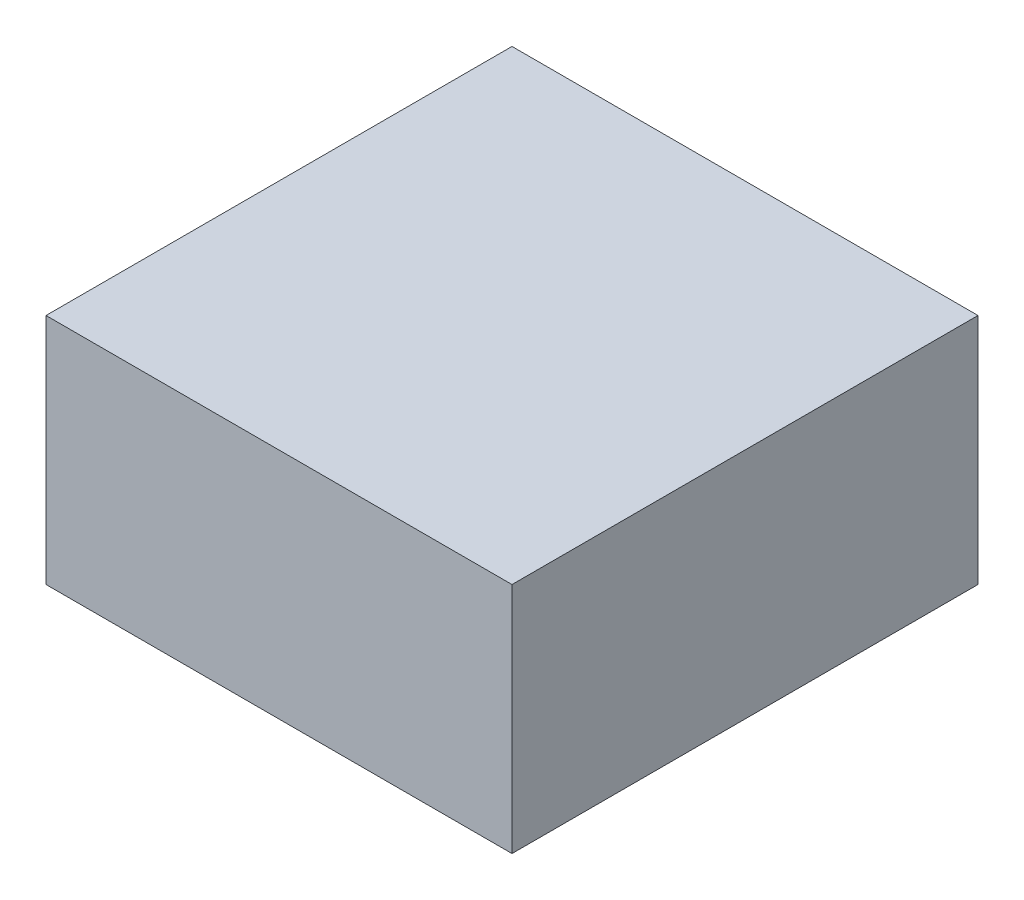
ISO-10303-21;
HEADER;
FILE_DESCRIPTION(('STEP AP214'),'2;1');
FILE_NAME('part.step','',(''),(''),'','','');
FILE_SCHEMA(('AUTOMOTIVE_DESIGN { 1 0 10303 214 1 1 1 1 }'));
ENDSEC;
DATA;
#1=APPLICATION_CONTEXT('core data for automotive mechanical design processes');
#2=APPLICATION_PROTOCOL_DEFINITION('international standard','automotive_design',2000,#1);
#3=PRODUCT_CONTEXT('',#1,'mechanical');
#4=PRODUCT('Part','Part','',(#3));
#5=PRODUCT_RELATED_PRODUCT_CATEGORY('part','',(#4));
#6=PRODUCT_DEFINITION_FORMATION('','',#4);
#7=PRODUCT_DEFINITION_CONTEXT('part definition',#1,'design');
#8=PRODUCT_DEFINITION('design','',#6,#7);
#9=PRODUCT_DEFINITION_SHAPE('','',#8);
#10=(LENGTH_UNIT() NAMED_UNIT(*) SI_UNIT(.MILLI.,.METRE.));
#11=(NAMED_UNIT(*) PLANE_ANGLE_UNIT() SI_UNIT($,.RADIAN.));
#12=(NAMED_UNIT(*) SI_UNIT($,.STERADIAN.) SOLID_ANGLE_UNIT());
#13=UNCERTAINTY_MEASURE_WITH_UNIT(LENGTH_MEASURE(1.E-05),#10,'distance_accuracy_value','');
#14=(GEOMETRIC_REPRESENTATION_CONTEXT(3) GLOBAL_UNCERTAINTY_ASSIGNED_CONTEXT((#13)) GLOBAL_UNIT_ASSIGNED_CONTEXT((#10,
#11,#12)) REPRESENTATION_CONTEXT('',''));
#15=CARTESIAN_POINT('',(0.,0.,0.));
#16=DIRECTION('',(0.,0.,1.));
#17=DIRECTION('',(1.,0.,0.));
#18=AXIS2_PLACEMENT_3D('',#15,#16,#17);
#19=CARTESIAN_POINT('',(6.35,92.65,6.35));
#20=DIRECTION('',(0.,1.,0.));
#21=DIRECTION('',(0.,0.,1.));
#22=AXIS2_PLACEMENT_3D('',#19,#20,#21);
#23=PLANE('',#22);
#24=DIRECTION('',(0.,0.,-1.));
#25=VECTOR('',#24,1.);
#26=CARTESIAN_POINT('',(-6.35,92.65,6.35));
#27=LINE('',#26,#25);
#28=CARTESIAN_POINT('',(-6.35,92.65,6.35));
#29=VERTEX_POINT('',#28);
#30=CARTESIAN_POINT('',(-6.35,92.65,-6.35));
#31=VERTEX_POINT('',#30);
#32=EDGE_CURVE('E101',#29,#31,#27,.T.);
#33=ORIENTED_EDGE('',*,*,#32,.T.);
#34=DIRECTION('',(-1.,0.,0.));
#35=VECTOR('',#34,1.);
#36=CARTESIAN_POINT('',(6.35,92.65,-6.35));
#37=LINE('',#36,#35);
#38=CARTESIAN_POINT('',(6.35,92.65,-6.35));
#39=VERTEX_POINT('',#38);
#40=EDGE_CURVE('E11',#39,#31,#37,.T.);
#41=ORIENTED_EDGE('',*,*,#40,.F.);
#42=DIRECTION('',(0.,0.,-1.));
#43=VECTOR('',#42,1.);
#44=CARTESIAN_POINT('',(6.35,92.65,6.35));
#45=LINE('',#44,#43);
#46=CARTESIAN_POINT('',(6.35,92.65,6.35));
#47=VERTEX_POINT('',#46);
#48=EDGE_CURVE('E95',#47,#39,#45,.T.);
#49=ORIENTED_EDGE('',*,*,#48,.F.);
#50=DIRECTION('',(-1.,0.,0.));
#51=VECTOR('',#50,1.);
#52=CARTESIAN_POINT('',(6.35,92.65,6.35));
#53=LINE('',#52,#51);
#54=EDGE_CURVE('E99',#47,#29,#53,.T.);
#55=ORIENTED_EDGE('',*,*,#54,.T.);
#56=EDGE_LOOP('',(#33,#41,#49,#55));
#57=FACE_BOUND('',#56,.T.);
#58=ADVANCED_FACE('F41',(#57),#23,.F.);
#59=CARTESIAN_POINT('',(6.35,92.65,-6.35));
#60=DIRECTION('',(0.,0.,1.));
#61=DIRECTION('',(1.,0.,0.));
#62=AXIS2_PLACEMENT_3D('',#59,#60,#61);
#63=PLANE('',#62);
#64=DIRECTION('',(0.,1.,0.));
#65=VECTOR('',#64,1.);
#66=CARTESIAN_POINT('',(-6.35,92.65,-6.35));
#67=LINE('',#66,#65);
#68=CARTESIAN_POINT('',(-6.35,99.,-6.35));
#69=VERTEX_POINT('',#68);
#70=EDGE_CURVE('E96',#31,#69,#67,.T.);
#71=ORIENTED_EDGE('',*,*,#70,.T.);
#72=DIRECTION('',(-1.,0.,0.));
#73=VECTOR('',#72,1.);
#74=CARTESIAN_POINT('',(6.35,99.,-6.35));
#75=LINE('',#74,#73);
#76=CARTESIAN_POINT('',(6.35,99.,-6.35));
#77=VERTEX_POINT('',#76);
#78=EDGE_CURVE('E47',#77,#69,#75,.T.);
#79=ORIENTED_EDGE('',*,*,#78,.F.);
#80=DIRECTION('',(0.,1.,0.));
#81=VECTOR('',#80,1.);
#82=CARTESIAN_POINT('',(6.35,92.65,-6.35));
#83=LINE('',#82,#81);
#84=EDGE_CURVE('E90',#39,#77,#83,.T.);
#85=ORIENTED_EDGE('',*,*,#84,.F.);
#86=ORIENTED_EDGE('',*,*,#40,.T.);
#87=EDGE_LOOP('',(#71,#79,#85,#86));
#88=FACE_BOUND('',#87,.T.);
#89=ADVANCED_FACE('F94',(#88),#63,.F.);
#90=CARTESIAN_POINT('',(6.35,99.,-6.35));
#91=DIRECTION('',(0.,-1.,0.));
#92=DIRECTION('',(0.,0.,-1.));
#93=AXIS2_PLACEMENT_3D('',#90,#91,#92);
#94=PLANE('',#93);
#95=DIRECTION('',(0.,0.,1.));
#96=VECTOR('',#95,1.);
#97=CARTESIAN_POINT('',(-6.35,99.,-6.35));
#98=LINE('',#97,#96);
#99=CARTESIAN_POINT('',(-6.35,99.,6.35));
#100=VERTEX_POINT('',#99);
#101=EDGE_CURVE('E74',#69,#100,#98,.T.);
#102=ORIENTED_EDGE('',*,*,#101,.T.);
#103=DIRECTION('',(-1.,0.,0.));
#104=VECTOR('',#103,1.);
#105=CARTESIAN_POINT('',(6.35,99.,6.35));
#106=LINE('',#105,#104);
#107=CARTESIAN_POINT('',(6.35,99.,6.35));
#108=VERTEX_POINT('',#107);
#109=EDGE_CURVE('E100',#108,#100,#106,.T.);
#110=ORIENTED_EDGE('',*,*,#109,.F.);
#111=DIRECTION('',(0.,0.,1.));
#112=VECTOR('',#111,1.);
#113=CARTESIAN_POINT('',(6.35,99.,-6.35));
#114=LINE('',#113,#112);
#115=EDGE_CURVE('E89',#77,#108,#114,.T.);
#116=ORIENTED_EDGE('',*,*,#115,.F.);
#117=ORIENTED_EDGE('',*,*,#78,.T.);
#118=EDGE_LOOP('',(#102,#110,#116,#117));
#119=FACE_BOUND('',#118,.T.);
#120=ADVANCED_FACE('F97',(#119),#94,.F.);
#121=CARTESIAN_POINT('',(6.35,99.,6.35));
#122=DIRECTION('',(0.,0.,-1.));
#123=DIRECTION('',(-1.,0.,0.));
#124=AXIS2_PLACEMENT_3D('',#121,#122,#123);
#125=PLANE('',#124);
#126=DIRECTION('',(0.,-1.,0.));
#127=VECTOR('',#126,1.);
#128=CARTESIAN_POINT('',(-6.35,99.,6.35));
#129=LINE('',#128,#127);
#130=EDGE_CURVE('E79',#100,#29,#129,.T.);
#131=ORIENTED_EDGE('',*,*,#130,.T.);
#132=ORIENTED_EDGE('',*,*,#54,.F.);
#133=DIRECTION('',(0.,-1.,0.));
#134=VECTOR('',#133,1.);
#135=CARTESIAN_POINT('',(6.35,99.,6.35));
#136=LINE('',#135,#134);
#137=EDGE_CURVE('E60',#108,#47,#136,.T.);
#138=ORIENTED_EDGE('',*,*,#137,.F.);
#139=ORIENTED_EDGE('',*,*,#109,.T.);
#140=EDGE_LOOP('',(#131,#132,#138,#139));
#141=FACE_BOUND('',#140,.T.);
#142=ADVANCED_FACE('F112',(#141),#125,.F.);
#143=CARTESIAN_POINT('',(6.35,0.,0.));
#144=DIRECTION('',(1.,0.,0.));
#145=DIRECTION('',(0.,0.,-1.));
#146=AXIS2_PLACEMENT_3D('',#143,#144,#145);
#147=PLANE('',#146);
#148=ORIENTED_EDGE('',*,*,#48,.T.);
#149=ORIENTED_EDGE('',*,*,#84,.T.);
#150=ORIENTED_EDGE('',*,*,#115,.T.);
#151=ORIENTED_EDGE('',*,*,#137,.T.);
#152=EDGE_LOOP('',(#148,#149,#150,#151));
#153=FACE_BOUND('',#152,.T.);
#154=ADVANCED_FACE('F88',(#153),#147,.T.);
#155=CARTESIAN_POINT('',(-6.35,0.,0.));
#156=DIRECTION('',(1.,0.,0.));
#157=DIRECTION('',(0.,0.,-1.));
#158=AXIS2_PLACEMENT_3D('',#155,#156,#157);
#159=PLANE('',#158);
#160=ORIENTED_EDGE('',*,*,#32,.F.);
#161=ORIENTED_EDGE('',*,*,#130,.F.);
#162=ORIENTED_EDGE('',*,*,#101,.F.);
#163=ORIENTED_EDGE('',*,*,#70,.F.);
#164=EDGE_LOOP('',(#160,#161,#162,#163));
#165=FACE_BOUND('',#164,.T.);
#166=ADVANCED_FACE('F114',(#165),#159,.F.);
#167=CLOSED_SHELL('',(#58,#89,#120,#142,#154,#166));
#168=MANIFOLD_SOLID_BREP('B2',#167);
#169=ADVANCED_BREP_SHAPE_REPRESENTATION('',(#18,#168),#14);
#170=SHAPE_DEFINITION_REPRESENTATION(#9,#169);
ENDSEC;
END-ISO-10303-21;
